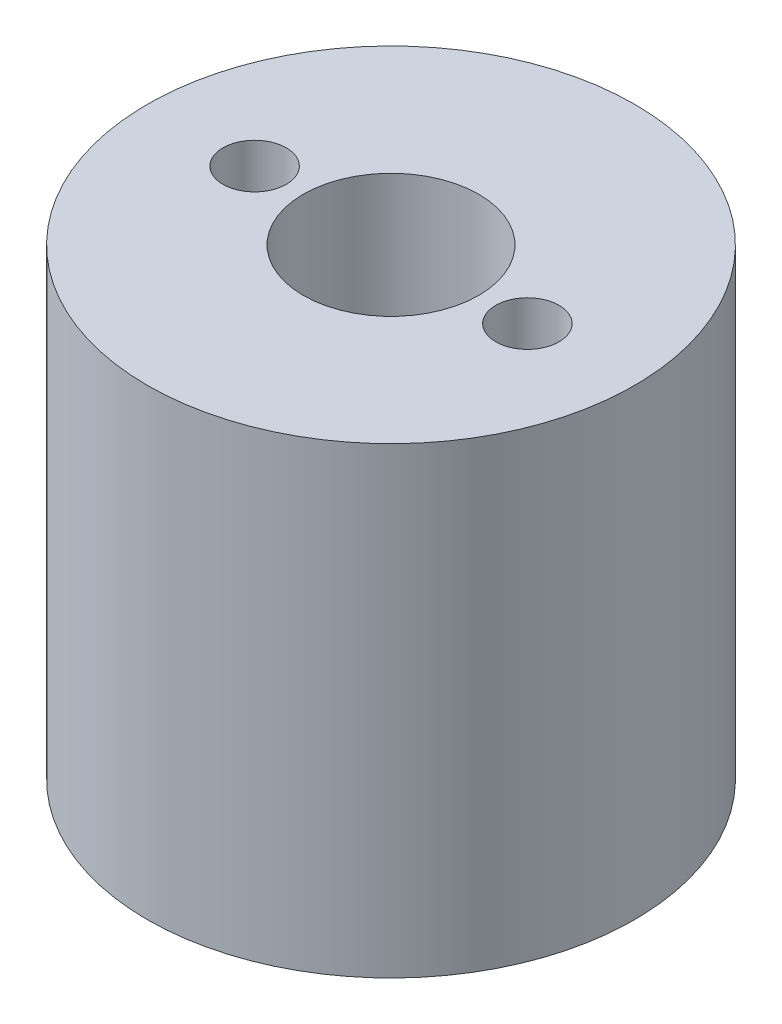
ISO-10303-21;
HEADER;
FILE_DESCRIPTION(('STEP AP214'),'2;1');
FILE_NAME('part.step','',(''),(''),'','','');
FILE_SCHEMA(('AUTOMOTIVE_DESIGN { 1 0 10303 214 1 1 1 1 }'));
ENDSEC;
DATA;
#1=APPLICATION_CONTEXT('core data for automotive mechanical design processes');
#2=APPLICATION_PROTOCOL_DEFINITION('international standard','automotive_design',2000,#1);
#3=PRODUCT_CONTEXT('',#1,'mechanical');
#4=PRODUCT('Part','Part','',(#3));
#5=PRODUCT_RELATED_PRODUCT_CATEGORY('part','',(#4));
#6=PRODUCT_DEFINITION_FORMATION('','',#4);
#7=PRODUCT_DEFINITION_CONTEXT('part definition',#1,'design');
#8=PRODUCT_DEFINITION('design','',#6,#7);
#9=PRODUCT_DEFINITION_SHAPE('','',#8);
#10=(LENGTH_UNIT() NAMED_UNIT(*) SI_UNIT(.MILLI.,.METRE.));
#11=(NAMED_UNIT(*) PLANE_ANGLE_UNIT() SI_UNIT($,.RADIAN.));
#12=(NAMED_UNIT(*) SI_UNIT($,.STERADIAN.) SOLID_ANGLE_UNIT());
#13=UNCERTAINTY_MEASURE_WITH_UNIT(LENGTH_MEASURE(1.E-05),#10,'distance_accuracy_value','');
#14=(GEOMETRIC_REPRESENTATION_CONTEXT(3) GLOBAL_UNCERTAINTY_ASSIGNED_CONTEXT((#13)) GLOBAL_UNIT_ASSIGNED_CONTEXT((#10,
#11,#12)) REPRESENTATION_CONTEXT('',''));
#15=CARTESIAN_POINT('',(0.,0.,0.));
#16=DIRECTION('',(0.,0.,1.));
#17=DIRECTION('',(1.,0.,0.));
#18=AXIS2_PLACEMENT_3D('',#15,#16,#17);
#19=CARTESIAN_POINT('',(0.,5.,0.));
#20=DIRECTION('',(0.,1.,0.));
#21=DIRECTION('',(0.,0.,1.));
#22=AXIS2_PLACEMENT_3D('',#19,#20,#21);
#23=PLANE('',#22);
#24=CARTESIAN_POINT('',(0.,5.,0.));
#25=DIRECTION('',(0.,1.,0.));
#26=DIRECTION('',(0.,0.,1.));
#27=AXIS2_PLACEMENT_3D('',#24,#25,#26);
#28=CIRCLE('',#27,2.1);
#29=CARTESIAN_POINT('',(0.,5.,2.1));
#30=VERTEX_POINT('',#29);
#31=EDGE_CURVE('E40',#30,#30,#28,.T.);
#32=ORIENTED_EDGE('',*,*,#31,.F.);
#33=EDGE_LOOP('',(#32));
#34=FACE_BOUND('',#33,.T.);
#35=CARTESIAN_POINT('',(0.,5.,0.));
#36=DIRECTION('',(0.,1.,0.));
#37=DIRECTION('',(0.,0.,1.));
#38=AXIS2_PLACEMENT_3D('',#35,#36,#37);
#39=CIRCLE('',#38,3.6);
#40=CARTESIAN_POINT('',(0.,5.,3.6));
#41=VERTEX_POINT('',#40);
#42=EDGE_CURVE('E54',#41,#41,#39,.T.);
#43=ORIENTED_EDGE('',*,*,#42,.T.);
#44=EDGE_LOOP('',(#43));
#45=FACE_BOUND('',#44,.T.);
#46=ADVANCED_FACE('F33',(#34,#45),#23,.T.);
#47=CARTESIAN_POINT('',(0.,0.,0.));
#48=DIRECTION('',(0.,1.,0.));
#49=DIRECTION('',(0.,0.,1.));
#50=AXIS2_PLACEMENT_3D('',#47,#48,#49);
#51=PLANE('',#50);
#52=CARTESIAN_POINT('',(-5.6,0.,0.));
#53=DIRECTION('',(0.,1.,0.));
#54=DIRECTION('',(0.,0.,1.));
#55=AXIS2_PLACEMENT_3D('',#52,#53,#54);
#56=CIRCLE('',#55,1.3);
#57=CARTESIAN_POINT('',(-5.6,0.,1.3));
#58=VERTEX_POINT('',#57);
#59=EDGE_CURVE('E57',#58,#58,#56,.T.);
#60=ORIENTED_EDGE('',*,*,#59,.T.);
#61=EDGE_LOOP('',(#60));
#62=FACE_BOUND('',#61,.T.);
#63=CARTESIAN_POINT('',(5.6,0.,0.));
#64=DIRECTION('',(0.,1.,0.));
#65=DIRECTION('',(0.,0.,1.));
#66=AXIS2_PLACEMENT_3D('',#63,#64,#65);
#67=CIRCLE('',#66,1.3);
#68=CARTESIAN_POINT('',(5.6,0.,1.3));
#69=VERTEX_POINT('',#68);
#70=EDGE_CURVE('E63',#69,#69,#67,.T.);
#71=ORIENTED_EDGE('',*,*,#70,.T.);
#72=EDGE_LOOP('',(#71));
#73=FACE_BOUND('',#72,.T.);
#74=CARTESIAN_POINT('',(0.,0.,0.));
#75=DIRECTION('',(0.,1.,0.));
#76=DIRECTION('',(0.,0.,1.));
#77=AXIS2_PLACEMENT_3D('',#74,#75,#76);
#78=CIRCLE('',#77,10.);
#79=CARTESIAN_POINT('',(0.,0.,10.));
#80=VERTEX_POINT('',#79);
#81=EDGE_CURVE('E10',#80,#80,#78,.T.);
#82=ORIENTED_EDGE('',*,*,#81,.F.);
#83=EDGE_LOOP('',(#82));
#84=FACE_BOUND('',#83,.T.);
#85=CARTESIAN_POINT('',(0.,0.,0.));
#86=DIRECTION('',(0.,1.,0.));
#87=DIRECTION('',(0.,0.,1.));
#88=AXIS2_PLACEMENT_3D('',#85,#86,#87);
#89=CIRCLE('',#88,2.1);
#90=CARTESIAN_POINT('',(0.,0.,2.1));
#91=VERTEX_POINT('',#90);
#92=EDGE_CURVE('E44',#91,#91,#89,.T.);
#93=ORIENTED_EDGE('',*,*,#92,.T.);
#94=EDGE_LOOP('',(#93));
#95=FACE_BOUND('',#94,.T.);
#96=ADVANCED_FACE('F72',(#62,#73,#84,#95),#51,.F.);
#97=CARTESIAN_POINT('',(0.,5.,0.));
#98=DIRECTION('',(0.,-1.,0.));
#99=DIRECTION('',(0.,0.,-1.));
#100=AXIS2_PLACEMENT_3D('',#97,#98,#99);
#101=CYLINDRICAL_SURFACE('',#100,10.);
#102=ORIENTED_EDGE('',*,*,#81,.T.);
#103=EDGE_LOOP('',(#102));
#104=FACE_BOUND('',#103,.T.);
#105=CARTESIAN_POINT('',(0.,19.,0.));
#106=DIRECTION('',(0.,1.,0.));
#107=DIRECTION('',(0.,0.,1.));
#108=AXIS2_PLACEMENT_3D('',#105,#106,#107);
#109=CIRCLE('',#108,10.);
#110=CARTESIAN_POINT('',(0.,19.,10.));
#111=VERTEX_POINT('',#110);
#112=EDGE_CURVE('E49',#111,#111,#109,.T.);
#113=ORIENTED_EDGE('',*,*,#112,.F.);
#114=EDGE_LOOP('',(#113));
#115=FACE_BOUND('',#114,.T.);
#116=ADVANCED_FACE('F35',(#104,#115),#101,.T.);
#117=CARTESIAN_POINT('',(0.,5.,0.));
#118=DIRECTION('',(0.,-1.,0.));
#119=DIRECTION('',(0.,0.,-1.));
#120=AXIS2_PLACEMENT_3D('',#117,#118,#119);
#121=CYLINDRICAL_SURFACE('',#120,2.1);
#122=ORIENTED_EDGE('',*,*,#31,.T.);
#123=EDGE_LOOP('',(#122));
#124=FACE_BOUND('',#123,.T.);
#125=ORIENTED_EDGE('',*,*,#92,.F.);
#126=EDGE_LOOP('',(#125));
#127=FACE_BOUND('',#126,.T.);
#128=ADVANCED_FACE('F86',(#124,#127),#121,.F.);
#129=CARTESIAN_POINT('',(0.,19.,0.));
#130=DIRECTION('',(0.,1.,0.));
#131=DIRECTION('',(0.,0.,1.));
#132=AXIS2_PLACEMENT_3D('',#129,#130,#131);
#133=PLANE('',#132);
#134=CARTESIAN_POINT('',(-5.6,19.,0.));
#135=DIRECTION('',(0.,1.,0.));
#136=DIRECTION('',(0.,0.,1.));
#137=AXIS2_PLACEMENT_3D('',#134,#135,#136);
#138=CIRCLE('',#137,1.3);
#139=CARTESIAN_POINT('',(-5.6,19.,1.3));
#140=VERTEX_POINT('',#139);
#141=EDGE_CURVE('E66',#140,#140,#138,.T.);
#142=ORIENTED_EDGE('',*,*,#141,.F.);
#143=EDGE_LOOP('',(#142));
#144=FACE_BOUND('',#143,.T.);
#145=CARTESIAN_POINT('',(5.6,19.,0.));
#146=DIRECTION('',(0.,1.,0.));
#147=DIRECTION('',(0.,0.,1.));
#148=AXIS2_PLACEMENT_3D('',#145,#146,#147);
#149=CIRCLE('',#148,1.3);
#150=CARTESIAN_POINT('',(5.6,19.,1.3));
#151=VERTEX_POINT('',#150);
#152=EDGE_CURVE('E60',#151,#151,#149,.T.);
#153=ORIENTED_EDGE('',*,*,#152,.F.);
#154=EDGE_LOOP('',(#153));
#155=FACE_BOUND('',#154,.T.);
#156=ORIENTED_EDGE('',*,*,#112,.T.);
#157=EDGE_LOOP('',(#156));
#158=FACE_BOUND('',#157,.T.);
#159=CARTESIAN_POINT('',(0.,19.,0.));
#160=DIRECTION('',(0.,1.,0.));
#161=DIRECTION('',(0.,0.,1.));
#162=AXIS2_PLACEMENT_3D('',#159,#160,#161);
#163=CIRCLE('',#162,3.6);
#164=CARTESIAN_POINT('',(0.,19.,3.6));
#165=VERTEX_POINT('',#164);
#166=EDGE_CURVE('E53',#165,#165,#163,.T.);
#167=ORIENTED_EDGE('',*,*,#166,.F.);
#168=EDGE_LOOP('',(#167));
#169=FACE_BOUND('',#168,.T.);
#170=ADVANCED_FACE('F82',(#144,#155,#158,#169),#133,.T.);
#171=CARTESIAN_POINT('',(0.,19.,0.));
#172=DIRECTION('',(0.,-1.,0.));
#173=DIRECTION('',(0.,0.,-1.));
#174=AXIS2_PLACEMENT_3D('',#171,#172,#173);
#175=CYLINDRICAL_SURFACE('',#174,3.6);
#176=ORIENTED_EDGE('',*,*,#166,.T.);
#177=EDGE_LOOP('',(#176));
#178=FACE_BOUND('',#177,.T.);
#179=ORIENTED_EDGE('',*,*,#42,.F.);
#180=EDGE_LOOP('',(#179));
#181=FACE_BOUND('',#180,.T.);
#182=ADVANCED_FACE('F85',(#178,#181),#175,.F.);
#183=CARTESIAN_POINT('',(5.6,0.,0.));
#184=DIRECTION('',(0.,1.,0.));
#185=DIRECTION('',(0.,0.,1.));
#186=AXIS2_PLACEMENT_3D('',#183,#184,#185);
#187=CYLINDRICAL_SURFACE('',#186,1.3);
#188=ORIENTED_EDGE('',*,*,#70,.F.);
#189=EDGE_LOOP('',(#188));
#190=FACE_BOUND('',#189,.T.);
#191=ORIENTED_EDGE('',*,*,#152,.T.);
#192=EDGE_LOOP('',(#191));
#193=FACE_BOUND('',#192,.T.);
#194=ADVANCED_FACE('F78',(#190,#193),#187,.F.);
#195=CARTESIAN_POINT('',(-5.6,0.,0.));
#196=DIRECTION('',(0.,1.,0.));
#197=DIRECTION('',(0.,0.,1.));
#198=AXIS2_PLACEMENT_3D('',#195,#196,#197);
#199=CYLINDRICAL_SURFACE('',#198,1.3);
#200=ORIENTED_EDGE('',*,*,#59,.F.);
#201=EDGE_LOOP('',(#200));
#202=FACE_BOUND('',#201,.T.);
#203=ORIENTED_EDGE('',*,*,#141,.T.);
#204=EDGE_LOOP('',(#203));
#205=FACE_BOUND('',#204,.T.);
#206=ADVANCED_FACE('F75',(#202,#205),#199,.F.);
#207=CLOSED_SHELL('',(#46,#96,#116,#128,#170,#182,#194,#206));
#208=MANIFOLD_SOLID_BREP('B2',#207);
#209=ADVANCED_BREP_SHAPE_REPRESENTATION('',(#18,#208),#14);
#210=SHAPE_DEFINITION_REPRESENTATION(#9,#209);
ENDSEC;
END-ISO-10303-21;
